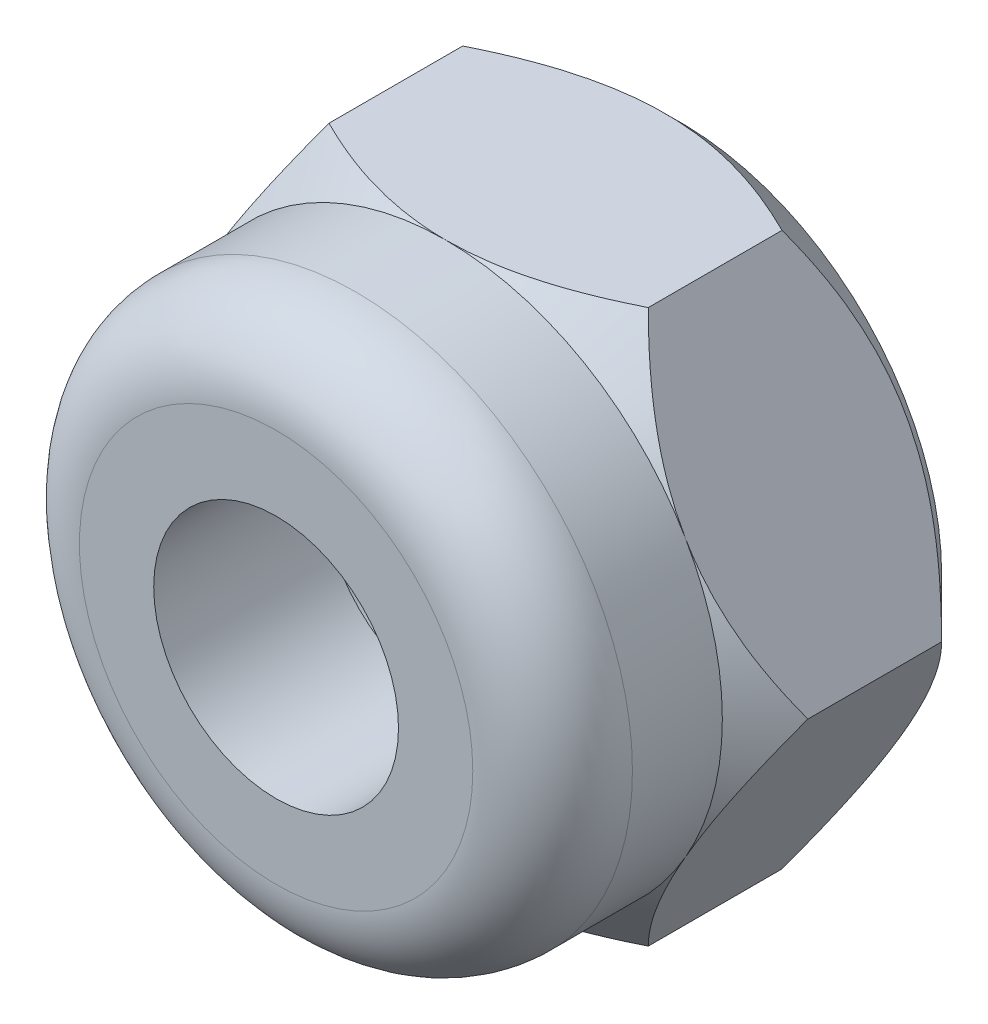
ISO-10303-21;
HEADER;
FILE_DESCRIPTION(('STEP AP214'),'2;1');
FILE_NAME('part.step','',(''),(''),'','','');
FILE_SCHEMA(('AUTOMOTIVE_DESIGN { 1 0 10303 214 1 1 1 1 }'));
ENDSEC;
DATA;
#1=APPLICATION_CONTEXT('core data for automotive mechanical design processes');
#2=APPLICATION_PROTOCOL_DEFINITION('international standard','automotive_design',2000,#1);
#3=PRODUCT_CONTEXT('',#1,'mechanical');
#4=PRODUCT('Part','Part','',(#3));
#5=PRODUCT_RELATED_PRODUCT_CATEGORY('part','',(#4));
#6=PRODUCT_DEFINITION_FORMATION('','',#4);
#7=PRODUCT_DEFINITION_CONTEXT('part definition',#1,'design');
#8=PRODUCT_DEFINITION('design','',#6,#7);
#9=PRODUCT_DEFINITION_SHAPE('','',#8);
#10=(LENGTH_UNIT() NAMED_UNIT(*) SI_UNIT(.MILLI.,.METRE.));
#11=(NAMED_UNIT(*) PLANE_ANGLE_UNIT() SI_UNIT($,.RADIAN.));
#12=(NAMED_UNIT(*) SI_UNIT($,.STERADIAN.) SOLID_ANGLE_UNIT());
#13=UNCERTAINTY_MEASURE_WITH_UNIT(LENGTH_MEASURE(1.E-05),#10,'distance_accuracy_value','');
#14=(GEOMETRIC_REPRESENTATION_CONTEXT(3) GLOBAL_UNCERTAINTY_ASSIGNED_CONTEXT((#13)) GLOBAL_UNIT_ASSIGNED_CONTEXT((#10,
#11,#12)) REPRESENTATION_CONTEXT('',''));
#15=CARTESIAN_POINT('',(0.,0.,0.));
#16=DIRECTION('',(0.,0.,1.));
#17=DIRECTION('',(1.,0.,0.));
#18=AXIS2_PLACEMENT_3D('',#15,#16,#17);
#19=CARTESIAN_POINT('',(0.,0.,2.57386505553611));
#20=DIRECTION('',(0.,0.,-1.));
#21=DIRECTION('',(-1.,0.,0.));
#22=AXIS2_PLACEMENT_3D('',#19,#20,#21);
#23=CONICAL_SURFACE('',#22,2.22942842933192,0.785398163397449);
#24=CARTESIAN_POINT('',(-1.49988452994616,2.59827621135331,1.80317800814779));
#25=CARTESIAN_POINT('',(-1.55144722349691,2.5089670063483,1.85469711775875));
#26=CARTESIAN_POINT('',(-1.60387211673928,2.41816442767115,1.90319046663452));
#27=CARTESIAN_POINT('',(-1.71077226218962,2.23300794441466,1.99198068849083));
#28=CARTESIAN_POINT('',(-1.76525768116978,2.13863643046934,2.03222815795243));
#29=CARTESIAN_POINT('',(-1.87512493116896,1.94834077138289,2.10117288839556));
#30=CARTESIAN_POINT('',(-1.93047878107054,1.85246509095881,2.13004344180867));
#31=CARTESIAN_POINT('',(-2.04240509746255,1.65860302426383,2.17452454451345));
#32=CARTESIAN_POINT('',(-2.09897414464143,1.56062256041425,2.19016829834001));
#33=CARTESIAN_POINT('',(-2.19646775987112,1.39175866542285,2.2042830000289));
#34=CARTESIAN_POINT('',(-2.23726637253299,1.32109339541416,2.20637244971718));
#35=CARTESIAN_POINT('',(-2.31879690787062,1.1798783658411,2.20285246120791));
#36=CARTESIAN_POINT('',(-2.35952880215513,1.10932865545181,2.19724032394711));
#37=CARTESIAN_POINT('',(-2.44060798692277,0.968895387997985,2.17863652716557));
#38=CARTESIAN_POINT('',(-2.48095479574427,0.899012665195873,2.16563661254145));
#39=CARTESIAN_POINT('',(-2.5609507195936,0.760455660690437,2.13297085921837));
#40=CARTESIAN_POINT('',(-2.60059988786284,0.691781286770257,2.11330553154122));
#41=CARTESIAN_POINT('',(-2.70215750741296,0.515878329813701,2.05492522459005));
#42=CARTESIAN_POINT('',(-2.76343628015066,0.409740382006532,2.01180983988893));
#43=CARTESIAN_POINT('',(-2.85354136829699,0.253673791316613,1.93902524931138));
#44=CARTESIAN_POINT('',(-2.88323502253943,0.20224287350633,1.91345210628246));
#45=CARTESIAN_POINT('',(-2.94207231156912,0.100333699527289,1.85997464795391));
#46=CARTESIAN_POINT('',(-2.97121627071292,0.049854881556518,1.83207176369631));
#47=CARTESIAN_POINT('',(-3.00011547005383,-0.000200000000003645,1.80317800814779));
#48=B_SPLINE_CURVE_WITH_KNOTS('',3,(#24,#25,#26,#27,#28,#29,#30,#31,#32,#33,#34,#35,#36,#37,#38,
#39,#40,#41,#42,#43,#44,#45,#46,#47),.UNSPECIFIED.,.F.,.F.,(4,2,2,2,2,2,2,2,2,2,2,4),(0.,
0.346074163660386,0.694164747986284,1.03672682350145,1.37842635662141,1.62295169669973,
1.86756275390828,2.11244767848963,2.3573138325552,2.74625844207636,2.94020339848826,
3.13403008860789),.UNSPECIFIED.);
#49=CARTESIAN_POINT('',(-1.5,2.59807621135331,1.80329348486803));
#50=VERTEX_POINT('',#49);
#51=CARTESIAN_POINT('',(-2.24999999999999,1.29903810567667,2.20521727351503));
#52=VERTEX_POINT('',#51);
#53=EDGE_CURVE('E196',#50,#52,#48,.T.);
#54=ORIENTED_EDGE('',*,*,#53,.T.);
#55=CARTESIAN_POINT('',(0.,0.,2.20521727351471));
#56=DIRECTION('',(0.,0.,-1.));
#57=DIRECTION('',(-1.,0.,0.));
#58=AXIS2_PLACEMENT_3D('',#55,#56,#57);
#59=CIRCLE('',#58,2.59807621135331);
#60=CARTESIAN_POINT('',(0.,2.59807621135331,2.20521727351503));
#61=VERTEX_POINT('',#60);
#62=EDGE_CURVE('E66',#52,#61,#59,.T.);
#63=ORIENTED_EDGE('',*,*,#62,.T.);
#64=CARTESIAN_POINT('',(-3.80350912944925,2.5980762113533,0.197136551175509));
#65=CARTESIAN_POINT('',(-3.70778366379153,2.5980762113533,0.276161413954016));
#66=CARTESIAN_POINT('',(-3.61160683557953,2.5980762113533,0.354648000713734));
#67=CARTESIAN_POINT('',(-3.41811677521426,2.59807621135331,0.510256407395326));
#68=CARTESIAN_POINT('',(-3.32080326399709,2.59807621135331,0.587377879963412));
#69=CARTESIAN_POINT('',(-3.12377066439065,2.59807621135331,0.740771263090381));
#70=CARTESIAN_POINT('',(-3.02403687478413,2.59807621135331,0.817024351054172));
#71=CARTESIAN_POINT('',(-2.82294264473002,2.59807621135331,0.967339820751415));
#72=CARTESIAN_POINT('',(-2.72158236587453,2.59807621135331,1.04140241805735));
#73=CARTESIAN_POINT('',(-2.50688663109646,2.59807621135331,1.19383211410952));
#74=CARTESIAN_POINT('',(-2.39334766095523,2.59807621135331,1.27191418152115));
#75=CARTESIAN_POINT('',(-2.16325208419809,2.59807621135331,1.42362357476867));
#76=CARTESIAN_POINT('',(-2.04669446810095,2.59807621135331,1.49724938216295));
#77=CARTESIAN_POINT('',(-1.8104523090726,2.59807621135331,1.63804860169915));
#78=CARTESIAN_POINT('',(-1.6907850029265,2.59807621135331,1.70525066658593));
#79=CARTESIAN_POINT('',(-1.44712532801577,2.59807621135331,1.83120605511657));
#80=CARTESIAN_POINT('',(-1.32313694802485,2.59807621135331,1.88996692688583));
#81=CARTESIAN_POINT('',(-1.10791398561966,2.59807621135331,1.9799990264565));
#82=CARTESIAN_POINT('',(-1.01793220088156,2.59807621135331,2.014243461323));
#83=CARTESIAN_POINT('',(-0.835493617661217,2.59807621135331,2.07553399190125));
#84=CARTESIAN_POINT('',(-0.743036484527015,2.59807621135331,2.10257910884552));
#85=CARTESIAN_POINT('',(-0.558099551090691,2.59807621135331,2.14742777571088));
#86=CARTESIAN_POINT('',(-0.465668229321034,2.59807621135331,2.16542778292097));
#87=CARTESIAN_POINT('',(-0.279437905275916,2.59807621135331,2.19185607646539));
#88=CARTESIAN_POINT('',(-0.185639254182876,2.59807621135331,2.2002867781737));
#89=CARTESIAN_POINT('',(-0.00286700016591524,2.59807621135331,2.20673212428979));
#90=CARTESIAN_POINT('',(0.0860872252265455,2.59807621135331,2.20529589531127));
#91=CARTESIAN_POINT('',(0.263383941558777,2.59807621135332,2.19339993733031));
#92=CARTESIAN_POINT('',(0.35172639123118,2.59807621135332,2.18293960546939));
#93=CARTESIAN_POINT('',(0.528709715545314,2.59807621135332,2.15343251877548));
#94=CARTESIAN_POINT('',(0.617322932984045,2.59807621135332,2.13422260731961));
#95=CARTESIAN_POINT('',(0.792550777862135,2.59807621135332,2.08833762809652));
#96=CARTESIAN_POINT('',(0.879165421988332,2.59807621135332,2.06166262268259));
#97=CARTESIAN_POINT('',(1.13858438588009,2.59807621135332,1.97138190073666));
#98=CARTESIAN_POINT('',(1.30802338603824,2.59807621135332,1.89808621458222));
#99=CARTESIAN_POINT('',(1.55603490347591,2.59807621135332,1.77574019593487));
#100=CARTESIAN_POINT('',(1.63782953061901,2.59807621135332,1.73279821319224));
#101=CARTESIAN_POINT('',(1.7995730895952,2.59807621135332,1.64356109017714));
#102=CARTESIAN_POINT('',(1.87952233518487,2.59807621135332,1.59726652554051));
#103=CARTESIAN_POINT('',(2.03387519181044,2.59807621135332,1.5043477169799));
#104=CARTESIAN_POINT('',(2.10835758287758,2.59807621135332,1.4578528790655));
#105=CARTESIAN_POINT('',(2.25604412200338,2.59807621135332,1.36286625810512));
#106=CARTESIAN_POINT('',(2.3292481750286,2.59807621135332,1.31437432748485));
#107=CARTESIAN_POINT('',(2.4739607958091,2.59807621135332,1.21613913205243));
#108=CARTESIAN_POINT('',(2.54547820472303,2.59807621135332,1.16640883742518));
#109=CARTESIAN_POINT('',(2.68752952525411,2.59807621135332,1.06560222019825));
#110=CARTESIAN_POINT('',(2.75806370232726,2.59807621135332,1.014526272103));
#111=CARTESIAN_POINT('',(2.82818506391956,2.59807621135332,0.962898875485065));
#112=B_SPLINE_CURVE_WITH_KNOTS('',3,(#64,#65,#66,#67,#68,#69,#70,#71,#72,#73,#74,#75,#76,#77,
#78,#79,#80,#81,#82,#83,#84,#85,#86,#87,#88,#89,#90,#91,#92,#93,#94,#95,#96,#97,#98,#99,#100,
#101,#102,#103,#104,#105,#106,#107,#108,#109,#110,#111),.UNSPECIFIED.,.F.,.F.,(4,2,2,2,2,2,2,2,
2,2,2,2,2,2,2,2,2,2,2,2,2,2,2,4),(0.,0.372396476963739,0.744886386345557,1.12149496460174,
1.49806635555984,1.9113780602901,2.32482981450828,2.73634172711931,3.14748334364566,
3.43607713103734,3.72471013354955,4.00676919802309,4.28875705255052,4.55518366841084,
4.82162808437625,5.09325835797445,5.36488636280862,5.91702911931544,6.19414916038392,
6.47122173244488,6.73459875975047,6.99799528422773,7.25930337482965,7.52053949423537),.UNSPECIFIED.);
#113=EDGE_CURVE('E204',#61,#50,#112,.F.);
#114=ORIENTED_EDGE('',*,*,#113,.T.);
#115=EDGE_LOOP('',(#54,#63,#114));
#116=FACE_BOUND('',#115,.T.);
#117=ADVANCED_FACE('F51',(#116),#23,.T.);
#118=CARTESIAN_POINT('',(1.5,2.59807621135332,1.80329348486803));
#119=VERTEX_POINT('',#118);
#120=EDGE_CURVE('E137',#119,#61,#112,.F.);
#121=ORIENTED_EDGE('',*,*,#120,.T.);
#122=CARTESIAN_POINT('',(2.25,1.29903810567666,2.20521727351503));
#123=VERTEX_POINT('',#122);
#124=EDGE_CURVE('E123',#61,#123,#59,.T.);
#125=ORIENTED_EDGE('',*,*,#124,.T.);
#126=CARTESIAN_POINT('',(3.00011547005384,-0.00019999999999772,1.80317800814778));
#127=CARTESIAN_POINT('',(2.94855277650309,0.0891092050050084,1.85469711775875));
#128=CARTESIAN_POINT('',(2.89612788326072,0.179911783682164,1.90319046663452));
#129=CARTESIAN_POINT('',(2.78922773781038,0.365068266938651,1.99198068849083));
#130=CARTESIAN_POINT('',(2.73474231883022,0.459439780883976,2.03222815795242));
#131=CARTESIAN_POINT('',(2.62487506883104,0.649735439970426,2.10117288839556));
#132=CARTESIAN_POINT('',(2.56952121892946,0.745611120394506,2.13004344180866));
#133=CARTESIAN_POINT('',(2.45759490253745,0.939473187089484,2.17452454451344));
#134=CARTESIAN_POINT('',(2.40102585535857,1.03745365093907,2.19016829834));
#135=CARTESIAN_POINT('',(2.30353224012888,1.20631754593047,2.20428300002889));
#136=CARTESIAN_POINT('',(2.262733627467,1.27698281593916,2.20637244971717));
#137=CARTESIAN_POINT('',(2.18120309212938,1.41819784551222,2.2028524612079));
#138=CARTESIAN_POINT('',(2.14047119784487,1.4887475559015,2.1972403239471));
#139=CARTESIAN_POINT('',(2.05939201307723,1.62918082335533,2.17863652716556));
#140=CARTESIAN_POINT('',(2.01904520425572,1.69906354615744,2.16563661254144));
#141=CARTESIAN_POINT('',(1.9390492804064,1.83762055066288,2.13297085921836));
#142=CARTESIAN_POINT('',(1.89940011213715,1.90629492458306,2.11330553154121));
#143=CARTESIAN_POINT('',(1.79784249258704,2.08219788153961,2.05492522459005));
#144=CARTESIAN_POINT('',(1.73656371984933,2.18833582934678,2.01180983988892));
#145=CARTESIAN_POINT('',(1.646458631703,2.3444024200367,1.93902524931138));
#146=CARTESIAN_POINT('',(1.61676497746056,2.39583333784698,1.91345210628246));
#147=CARTESIAN_POINT('',(1.55792768843087,2.49774251182602,1.85997464795391));
#148=CARTESIAN_POINT('',(1.52878372928707,2.54822132979679,1.83207176369631));
#149=CARTESIAN_POINT('',(1.49988452994616,2.59827621135331,1.80317800814778));
#150=B_SPLINE_CURVE_WITH_KNOTS('',3,(#126,#127,#128,#129,#130,#131,#132,#133,#134,#135,#136,
#137,#138,#139,#140,#141,#142,#143,#144,#145,#146,#147,#148,#149),.UNSPECIFIED.,.F.,.F.,(4,2,2,
2,2,2,2,2,2,2,2,4),(0.,0.346074163660387,0.694164747986286,1.03672682350145,1.37842635662141,
1.62295169669973,1.86756275390829,2.11244767848964,2.35731383255521,2.74625844207636,
2.94020339848826,3.13403008860789),.UNSPECIFIED.);
#151=EDGE_CURVE('E135',#123,#119,#150,.T.);
#152=ORIENTED_EDGE('',*,*,#151,.T.);
#153=EDGE_LOOP('',(#121,#125,#152));
#154=FACE_BOUND('',#153,.T.);
#155=ADVANCED_FACE('F134',(#154),#23,.T.);
#156=CARTESIAN_POINT('',(3.,0.,1.80329348486803));
#157=VERTEX_POINT('',#156);
#158=EDGE_CURVE('E144',#157,#123,#150,.T.);
#159=ORIENTED_EDGE('',*,*,#158,.T.);
#160=CARTESIAN_POINT('',(2.25,-1.29903810567665,2.20521727351503));
#161=VERTEX_POINT('',#160);
#162=EDGE_CURVE('E120',#123,#161,#59,.T.);
#163=ORIENTED_EDGE('',*,*,#162,.T.);
#164=CARTESIAN_POINT('',(1.49988452994617,-2.59827621135331,1.80317800814778));
#165=CARTESIAN_POINT('',(1.55144722349692,-2.50896700634831,1.85469711775875));
#166=CARTESIAN_POINT('',(1.60387211673929,-2.41816442767115,1.90319046663452));
#167=CARTESIAN_POINT('',(1.71077226218963,-2.23300794441466,1.99198068849083));
#168=CARTESIAN_POINT('',(1.76525768116979,-2.13863643046934,2.03222815795242));
#169=CARTESIAN_POINT('',(1.87512493116897,-1.94834077138289,2.10117288839556));
#170=CARTESIAN_POINT('',(1.93047878107055,-1.85246509095881,2.13004344180866));
#171=CARTESIAN_POINT('',(2.04240509746255,-1.65860302426383,2.17452454451344));
#172=CARTESIAN_POINT('',(2.09897414464143,-1.56062256041425,2.19016829834));
#173=CARTESIAN_POINT('',(2.19646775987113,-1.39175866542285,2.20428300002889));
#174=CARTESIAN_POINT('',(2.237266372533,-1.32109339541416,2.20637244971717));
#175=CARTESIAN_POINT('',(2.31879690787063,-1.1798783658411,2.2028524612079));
#176=CARTESIAN_POINT('',(2.35952880215513,-1.10932865545181,2.1972403239471));
#177=CARTESIAN_POINT('',(2.44060798692278,-0.968895387997986,2.17863652716556));
#178=CARTESIAN_POINT('',(2.48095479574428,-0.899012665195874,2.16563661254144));
#179=CARTESIAN_POINT('',(2.5609507195936,-0.760455660690437,2.13297085921836));
#180=CARTESIAN_POINT('',(2.60059988786285,-0.691781286770257,2.11330553154121));
#181=CARTESIAN_POINT('',(2.70215750741297,-0.515878329813701,2.05492522459005));
#182=CARTESIAN_POINT('',(2.76343628015067,-0.409740382006532,2.01180983988892));
#183=CARTESIAN_POINT('',(2.853541368297,-0.253673791316613,1.93902524931138));
#184=CARTESIAN_POINT('',(2.88323502253944,-0.20224287350633,1.91345210628245));
#185=CARTESIAN_POINT('',(2.94207231156913,-0.10033369952729,1.85997464795391));
#186=CARTESIAN_POINT('',(2.97121627071293,-0.0498548815565191,1.83207176369631));
#187=CARTESIAN_POINT('',(3.00011547005384,0.000200000000002303,1.80317800814778));
#188=B_SPLINE_CURVE_WITH_KNOTS('',3,(#164,#165,#166,#167,#168,#169,#170,#171,#172,#173,#174,
#175,#176,#177,#178,#179,#180,#181,#182,#183,#184,#185,#186,#187),.UNSPECIFIED.,.F.,.F.,(4,2,2,
2,2,2,2,2,2,2,2,4),(0.,0.346074163660386,0.694164747986284,1.03672682350145,1.37842635662141,
1.62295169669973,1.86756275390828,2.11244767848963,2.35731383255521,2.74625844207636,
2.94020339848826,3.13403008860789),.UNSPECIFIED.);
#189=EDGE_CURVE('E152',#161,#157,#188,.T.);
#190=ORIENTED_EDGE('',*,*,#189,.T.);
#191=EDGE_LOOP('',(#159,#163,#190));
#192=FACE_BOUND('',#191,.T.);
#193=ADVANCED_FACE('F151',(#192),#23,.T.);
#194=CARTESIAN_POINT('',(1.50000000000001,-2.59807621135331,1.80329348486803));
#195=VERTEX_POINT('',#194);
#196=EDGE_CURVE('E156',#195,#161,#188,.T.);
#197=ORIENTED_EDGE('',*,*,#196,.T.);
#198=CARTESIAN_POINT('',(0.,-2.59807621135331,2.20521727351503));
#199=VERTEX_POINT('',#198);
#200=EDGE_CURVE('E125',#161,#199,#59,.T.);
#201=ORIENTED_EDGE('',*,*,#200,.T.);
#202=CARTESIAN_POINT('',(-3.80350912944925,-2.59807621135332,0.197136551175498));
#203=CARTESIAN_POINT('',(-3.70778366379153,-2.59807621135332,0.276161413954005));
#204=CARTESIAN_POINT('',(-3.61160683557953,-2.59807621135332,0.354648000713724));
#205=CARTESIAN_POINT('',(-3.41811677521426,-2.59807621135332,0.510256407395316));
#206=CARTESIAN_POINT('',(-3.32080326399709,-2.59807621135332,0.587377879963403));
#207=CARTESIAN_POINT('',(-3.12377066439065,-2.59807621135332,0.740771263090372));
#208=CARTESIAN_POINT('',(-3.02403687478413,-2.59807621135332,0.817024351054164));
#209=CARTESIAN_POINT('',(-2.82294264473002,-2.59807621135332,0.967339820751409));
#210=CARTESIAN_POINT('',(-2.72158236587452,-2.59807621135332,1.04140241805734));
#211=CARTESIAN_POINT('',(-2.50688663109645,-2.59807621135332,1.19383211410951));
#212=CARTESIAN_POINT('',(-2.39334766095522,-2.59807621135332,1.27191418152114));
#213=CARTESIAN_POINT('',(-2.16325208419808,-2.59807621135332,1.42362357476867));
#214=CARTESIAN_POINT('',(-2.04669446810094,-2.59807621135332,1.49724938216295));
#215=CARTESIAN_POINT('',(-1.81045230907259,-2.59807621135332,1.63804860169915));
#216=CARTESIAN_POINT('',(-1.69078500292649,-2.59807621135332,1.70525066658593));
#217=CARTESIAN_POINT('',(-1.44712532801577,-2.59807621135332,1.83120605511657));
#218=CARTESIAN_POINT('',(-1.32313694802484,-2.59807621135332,1.88996692688582));
#219=CARTESIAN_POINT('',(-1.10791398561965,-2.59807621135332,1.9799990264565));
#220=CARTESIAN_POINT('',(-1.01793220088155,-2.59807621135332,2.014243461323));
#221=CARTESIAN_POINT('',(-0.835493617661208,-2.59807621135332,2.07553399190125));
#222=CARTESIAN_POINT('',(-0.743036484527007,-2.59807621135332,2.10257910884551));
#223=CARTESIAN_POINT('',(-0.558099551090683,-2.59807621135332,2.14742777571088));
#224=CARTESIAN_POINT('',(-0.465668229321026,-2.59807621135332,2.16542778292096));
#225=CARTESIAN_POINT('',(-0.279437905275908,-2.59807621135331,2.19185607646539));
#226=CARTESIAN_POINT('',(-0.185639254182867,-2.59807621135331,2.2002867781737));
#227=CARTESIAN_POINT('',(-0.00286700016590566,-2.59807621135331,2.20673212428979));
#228=CARTESIAN_POINT('',(0.086087225226555,-2.59807621135331,2.20529589531127));
#229=CARTESIAN_POINT('',(0.263383941558787,-2.59807621135331,2.19339993733031));
#230=CARTESIAN_POINT('',(0.351726391231191,-2.59807621135331,2.18293960546939));
#231=CARTESIAN_POINT('',(0.528709715545325,-2.59807621135331,2.15343251877548));
#232=CARTESIAN_POINT('',(0.617322932984055,-2.59807621135331,2.13422260731962));
#233=CARTESIAN_POINT('',(0.792550777862147,-2.59807621135331,2.08833762809652));
#234=CARTESIAN_POINT('',(0.879165421988343,-2.59807621135331,2.06166262268259));
#235=CARTESIAN_POINT('',(1.1385843858801,-2.59807621135331,1.97138190073666));
#236=CARTESIAN_POINT('',(1.30802338603825,-2.59807621135331,1.89808621458222));
#237=CARTESIAN_POINT('',(1.55603490347592,-2.59807621135331,1.77574019593487));
#238=CARTESIAN_POINT('',(1.63782953061902,-2.59807621135331,1.73279821319224));
#239=CARTESIAN_POINT('',(1.79957308959521,-2.59807621135331,1.64356109017714));
#240=CARTESIAN_POINT('',(1.87952233518488,-2.59807621135331,1.59726652554051));
#241=CARTESIAN_POINT('',(2.03387519181045,-2.59807621135331,1.5043477169799));
#242=CARTESIAN_POINT('',(2.10835758287759,-2.59807621135331,1.4578528790655));
#243=CARTESIAN_POINT('',(2.25604412200339,-2.59807621135331,1.36286625810511));
#244=CARTESIAN_POINT('',(2.32924817502861,-2.59807621135331,1.31437432748485));
#245=CARTESIAN_POINT('',(2.47396079580911,-2.59807621135331,1.21613913205243));
#246=CARTESIAN_POINT('',(2.54547820472304,-2.59807621135331,1.16640883742518));
#247=CARTESIAN_POINT('',(2.68752952525412,-2.59807621135331,1.06560222019825));
#248=CARTESIAN_POINT('',(2.75806370232728,-2.59807621135331,1.01452627210299));
#249=CARTESIAN_POINT('',(2.82818506391958,-2.59807621135331,0.962898875485063));
#250=B_SPLINE_CURVE_WITH_KNOTS('',3,(#202,#203,#204,#205,#206,#207,#208,#209,#210,#211,#212,
#213,#214,#215,#216,#217,#218,#219,#220,#221,#222,#223,#224,#225,#226,#227,#228,#229,#230,#231,
#232,#233,#234,#235,#236,#237,#238,#239,#240,#241,#242,#243,#244,#245,#246,#247,#248,#249),
.UNSPECIFIED.,.F.,.F.,(4,2,2,2,2,2,2,2,2,2,2,2,2,2,2,2,2,2,2,2,2,2,2,4),(0.,0.37239647696374,
0.74488638634556,1.12149496460175,1.49806635555984,1.91137806029011,2.32482981450829,
2.73634172711932,3.14748334364567,3.43607713103736,3.72471013354956,4.00676919802311,
4.28875705255053,4.55518366841086,4.82162808437627,5.09325835797447,5.36488636280864,
5.91702911931546,6.19414916038394,6.47122173244491,6.73459875975049,6.99799528422776,
7.25930337482967,7.52053949423539),.UNSPECIFIED.);
#251=EDGE_CURVE('E287',#199,#195,#250,.T.);
#252=ORIENTED_EDGE('',*,*,#251,.T.);
#253=EDGE_LOOP('',(#197,#201,#252));
#254=FACE_BOUND('',#253,.T.);
#255=ADVANCED_FACE('F381',(#254),#23,.T.);
#256=CARTESIAN_POINT('',(-1.49999999999999,-2.59807621135331,1.80329348486803));
#257=VERTEX_POINT('',#256);
#258=EDGE_CURVE('E281',#257,#199,#250,.T.);
#259=ORIENTED_EDGE('',*,*,#258,.T.);
#260=CARTESIAN_POINT('',(-2.25,-1.29903810567666,2.20521727351503));
#261=VERTEX_POINT('',#260);
#262=EDGE_CURVE('E349',#199,#261,#59,.T.);
#263=ORIENTED_EDGE('',*,*,#262,.T.);
#264=CARTESIAN_POINT('',(-3.00011547005383,0.000199999999996393,1.80317800814779));
#265=CARTESIAN_POINT('',(-2.94855277650308,-0.0891092050050094,1.85469711775875));
#266=CARTESIAN_POINT('',(-2.89612788326071,-0.179911783682165,1.90319046663452));
#267=CARTESIAN_POINT('',(-2.78922773781038,-0.365068266938651,1.99198068849083));
#268=CARTESIAN_POINT('',(-2.73474231883021,-0.459439780883975,2.03222815795243));
#269=CARTESIAN_POINT('',(-2.62487506883103,-0.649735439970425,2.10117288839556));
#270=CARTESIAN_POINT('',(-2.56952121892945,-0.745611120394505,2.13004344180867));
#271=CARTESIAN_POINT('',(-2.45759490253745,-0.939473187089482,2.17452454451345));
#272=CARTESIAN_POINT('',(-2.40102585535857,-1.03745365093906,2.19016829834001));
#273=CARTESIAN_POINT('',(-2.30353224012887,-1.20631754593046,2.2042830000289));
#274=CARTESIAN_POINT('',(-2.262733627467,-1.27698281593915,2.20637244971718));
#275=CARTESIAN_POINT('',(-2.18120309212937,-1.41819784551221,2.20285246120791));
#276=CARTESIAN_POINT('',(-2.14047119784487,-1.4887475559015,2.19724032394711));
#277=CARTESIAN_POINT('',(-2.05939201307722,-1.62918082335533,2.17863652716557));
#278=CARTESIAN_POINT('',(-2.01904520425572,-1.69906354615744,2.16563661254144));
#279=CARTESIAN_POINT('',(-1.9390492804064,-1.83762055066287,2.13297085921837));
#280=CARTESIAN_POINT('',(-1.89940011213715,-1.90629492458305,2.11330553154122));
#281=CARTESIAN_POINT('',(-1.79784249258703,-2.08219788153961,2.05492522459005));
#282=CARTESIAN_POINT('',(-1.73656371984933,-2.18833582934678,2.01180983988893));
#283=CARTESIAN_POINT('',(-1.646458631703,-2.3444024200367,1.93902524931138));
#284=CARTESIAN_POINT('',(-1.61676497746056,-2.39583333784698,1.91345210628246));
#285=CARTESIAN_POINT('',(-1.55792768843087,-2.49774251182602,1.85997464795391));
#286=CARTESIAN_POINT('',(-1.52878372928707,-2.54822132979679,1.83207176369631));
#287=CARTESIAN_POINT('',(-1.49988452994616,-2.59827621135331,1.80317800814779));
#288=B_SPLINE_CURVE_WITH_KNOTS('',3,(#264,#265,#266,#267,#268,#269,#270,#271,#272,#273,#274,
#275,#276,#277,#278,#279,#280,#281,#282,#283,#284,#285,#286,#287),.UNSPECIFIED.,.F.,.F.,(4,2,2,
2,2,2,2,2,2,2,2,4),(0.,0.346074163660385,0.694164747986283,1.03672682350145,1.37842635662141,
1.62295169669972,1.86756275390828,2.11244767848963,2.3573138325552,2.74625844207636,
2.94020339848826,3.13403008860789),.UNSPECIFIED.);
#289=EDGE_CURVE('E244',#261,#257,#288,.T.);
#290=ORIENTED_EDGE('',*,*,#289,.T.);
#291=EDGE_LOOP('',(#259,#263,#290));
#292=FACE_BOUND('',#291,.T.);
#293=ADVANCED_FACE('F379',(#292),#23,.T.);
#294=CARTESIAN_POINT('',(-2.99999999999999,0.,1.80329348486804));
#295=VERTEX_POINT('',#294);
#296=EDGE_CURVE('E188',#295,#261,#288,.T.);
#297=ORIENTED_EDGE('',*,*,#296,.T.);
#298=EDGE_CURVE('E266',#261,#52,#59,.T.);
#299=ORIENTED_EDGE('',*,*,#298,.T.);
#300=EDGE_CURVE('E205',#52,#295,#48,.T.);
#301=ORIENTED_EDGE('',*,*,#300,.T.);
#302=EDGE_LOOP('',(#297,#299,#301));
#303=FACE_BOUND('',#302,.T.);
#304=ADVANCED_FACE('F180',(#303),#23,.T.);
#305=CARTESIAN_POINT('',(-1.49999999999999,-2.59807621135331,0.));
#306=DIRECTION('',(0.,0.,1.));
#307=DIRECTION('',(1.,0.,0.));
#308=AXIS2_PLACEMENT_3D('',#305,#306,#307);
#309=PLANE('',#308);
#310=CARTESIAN_POINT('',(0.,0.,0.));
#311=DIRECTION('',(0.,0.,-1.));
#312=DIRECTION('',(1.,0.,0.));
#313=AXIS2_PLACEMENT_3D('',#310,#311,#312);
#314=CIRCLE('',#313,1.2295);
#315=CARTESIAN_POINT('',(1.2295,0.,0.));
#316=VERTEX_POINT('',#315);
#317=EDGE_CURVE('E346',#316,#316,#314,.T.);
#318=ORIENTED_EDGE('',*,*,#317,.F.);
#319=EDGE_LOOP('',(#318));
#320=FACE_BOUND('',#319,.T.);
#321=CARTESIAN_POINT('',(0.,0.,0.));
#322=DIRECTION('',(0.,0.,1.));
#323=DIRECTION('',(1.,0.,0.));
#324=AXIS2_PLACEMENT_3D('',#321,#322,#323);
#325=CIRCLE('',#324,2.45329348486803);
#326=CARTESIAN_POINT('',(2.45329348486803,0.,0.));
#327=VERTEX_POINT('',#326);
#328=EDGE_CURVE('E305',#327,#327,#325,.T.);
#329=ORIENTED_EDGE('',*,*,#328,.F.);
#330=EDGE_LOOP('',(#329));
#331=FACE_BOUND('',#330,.T.);
#332=ADVANCED_FACE('F386',(#320,#331),#309,.F.);
#333=CARTESIAN_POINT('',(0.,0.,1.175));
#334=DIRECTION('',(0.,0.,1.));
#335=DIRECTION('',(1.,0.,0.));
#336=AXIS2_PLACEMENT_3D('',#333,#334,#335);
#337=CONICAL_SURFACE('',#336,3.62829348486803,0.785398163397447);
#338=ORIENTED_EDGE('',*,*,#328,.T.);
#339=EDGE_LOOP('',(#338));
#340=FACE_BOUND('',#339,.T.);
#341=CARTESIAN_POINT('',(3.00011547005384,0.000200000000002248,0.546821991852221));
#342=CARTESIAN_POINT('',(2.94855277650309,-0.0891092050050035,0.495302882241254));
#343=CARTESIAN_POINT('',(2.89612788326072,-0.179911783682159,0.446809533365483));
#344=CARTESIAN_POINT('',(2.78922773781038,-0.365068266938645,0.358019311509173));
#345=CARTESIAN_POINT('',(2.73474231883022,-0.459439780883969,0.317771842047577));
#346=CARTESIAN_POINT('',(2.62487506883104,-0.649735439970419,0.248827111604444));
#347=CARTESIAN_POINT('',(2.56952121892946,-0.745611120394499,0.219956558191336));
#348=CARTESIAN_POINT('',(2.45759490253746,-0.939473187089476,0.175475455486558));
#349=CARTESIAN_POINT('',(2.40102585535858,-1.03745365093906,0.159831701659996));
#350=CARTESIAN_POINT('',(2.30353224012888,-1.20631754593046,0.145716999971108));
#351=CARTESIAN_POINT('',(2.26273362746701,-1.27698281593915,0.14362755028283));
#352=CARTESIAN_POINT('',(2.18120309212938,-1.4181978455122,0.147147538792101));
#353=CARTESIAN_POINT('',(2.14047119784488,-1.48874755590149,0.152759676052897));
#354=CARTESIAN_POINT('',(2.05939201307723,-1.62918082335532,0.171363472834438));
#355=CARTESIAN_POINT('',(2.01904520425573,-1.69906354615743,0.18436338745856));
#356=CARTESIAN_POINT('',(1.93904928040641,-1.83762055066287,0.217029140781639));
#357=CARTESIAN_POINT('',(1.89940011213716,-1.90629492458305,0.236694468458787));
#358=CARTESIAN_POINT('',(1.79784249258705,-2.0821978815396,0.295074775409952));
#359=CARTESIAN_POINT('',(1.73656371984934,-2.18833582934677,0.338190160111078));
#360=CARTESIAN_POINT('',(1.64645863170301,-2.34440242003669,0.410974750688623));
#361=CARTESIAN_POINT('',(1.61676497746057,-2.39583333784698,0.436547893717545));
#362=CARTESIAN_POINT('',(1.55792768843088,-2.49774251182602,0.490025352046095));
#363=CARTESIAN_POINT('',(1.52878372928708,-2.54822132979679,0.517928236303693));
#364=CARTESIAN_POINT('',(1.49988452994617,-2.59827621135331,0.546821991852221));
#365=B_SPLINE_CURVE_WITH_KNOTS('',3,(#341,#342,#343,#344,#345,#346,#347,#348,#349,#350,#351,
#352,#353,#354,#355,#356,#357,#358,#359,#360,#361,#362,#363,#364),.UNSPECIFIED.,.F.,.F.,(4,2,2,
2,2,2,2,2,2,2,2,4),(0.,0.346074163660385,0.694164747986282,1.03672682350145,1.37842635662141,
1.62295169669972,1.86756275390828,2.11244767848963,2.3573138325552,2.74625844207635,
2.94020339848825,3.13403008860789),.UNSPECIFIED.);
#366=CARTESIAN_POINT('',(3.,0.,0.546706515131974));
#367=VERTEX_POINT('',#366);
#368=CARTESIAN_POINT('',(1.5,-2.59807621135331,0.546706515131971));
#369=VERTEX_POINT('',#368);
#370=EDGE_CURVE('E74',#367,#369,#365,.T.);
#371=ORIENTED_EDGE('',*,*,#370,.T.);
#372=CARTESIAN_POINT('',(-3.80350912944924,-2.59807621135332,2.1528634488245));
#373=CARTESIAN_POINT('',(-3.70778366379152,-2.59807621135332,2.073838586046));
#374=CARTESIAN_POINT('',(-3.61160683557952,-2.59807621135332,1.99535199928628));
#375=CARTESIAN_POINT('',(-3.41811677521425,-2.59807621135332,1.83974359260469));
#376=CARTESIAN_POINT('',(-3.32080326399708,-2.59807621135332,1.7626221200366));
#377=CARTESIAN_POINT('',(-3.12377066439065,-2.59807621135332,1.60922873690963));
#378=CARTESIAN_POINT('',(-3.02403687478413,-2.59807621135332,1.53297564894584));
#379=CARTESIAN_POINT('',(-2.82294264473001,-2.59807621135332,1.38266017924859));
#380=CARTESIAN_POINT('',(-2.72158236587452,-2.59807621135332,1.30859758194266));
#381=CARTESIAN_POINT('',(-2.50688663109645,-2.59807621135332,1.15616788589049));
#382=CARTESIAN_POINT('',(-2.39334766095522,-2.59807621135332,1.07808581847886));
#383=CARTESIAN_POINT('',(-2.16325208419808,-2.59807621135332,0.926376425231334));
#384=CARTESIAN_POINT('',(-2.04669446810094,-2.59807621135332,0.852750617837054));
#385=CARTESIAN_POINT('',(-1.81045230907259,-2.59807621135332,0.711951398300852));
#386=CARTESIAN_POINT('',(-1.69078500292649,-2.59807621135332,0.644749333414072));
#387=CARTESIAN_POINT('',(-1.44712532801577,-2.59807621135332,0.51879394488343));
#388=CARTESIAN_POINT('',(-1.32313694802484,-2.59807621135332,0.460033073114177));
#389=CARTESIAN_POINT('',(-1.10791398561965,-2.59807621135332,0.3700009735435));
#390=CARTESIAN_POINT('',(-1.01793220088155,-2.59807621135332,0.335756538677002));
#391=CARTESIAN_POINT('',(-0.835493617661211,-2.59807621135332,0.274466008098753));
#392=CARTESIAN_POINT('',(-0.743036484527009,-2.59807621135332,0.247420891154486));
#393=CARTESIAN_POINT('',(-0.558099551090686,-2.59807621135332,0.202572224289124));
#394=CARTESIAN_POINT('',(-0.465668229321029,-2.59807621135332,0.184572217079036));
#395=CARTESIAN_POINT('',(-0.279437905275911,-2.59807621135331,0.15814392353461));
#396=CARTESIAN_POINT('',(-0.185639254182871,-2.59807621135331,0.149713221826298));
#397=CARTESIAN_POINT('',(-0.00286700016591032,-2.59807621135331,0.143267875710212));
#398=CARTESIAN_POINT('',(0.0860872252265501,-2.59807621135331,0.144704104688729));
#399=CARTESIAN_POINT('',(0.263383941558781,-2.59807621135331,0.156600062669694));
#400=CARTESIAN_POINT('',(0.351726391231185,-2.59807621135331,0.167060394530606));
#401=CARTESIAN_POINT('',(0.528709715545319,-2.59807621135331,0.196567481224519));
#402=CARTESIAN_POINT('',(0.617322932984049,-2.59807621135331,0.215777392680383));
#403=CARTESIAN_POINT('',(0.79255077786214,-2.59807621135331,0.261662371903476));
#404=CARTESIAN_POINT('',(0.879165421988336,-2.59807621135331,0.288337377317411));
#405=CARTESIAN_POINT('',(1.13858438588009,-2.59807621135331,0.378618099263342));
#406=CARTESIAN_POINT('',(1.30802338603824,-2.59807621135331,0.451913785417774));
#407=CARTESIAN_POINT('',(1.55603490347591,-2.59807621135331,0.574259804065128));
#408=CARTESIAN_POINT('',(1.63782953061901,-2.59807621135331,0.617201786807756));
#409=CARTESIAN_POINT('',(1.79957308959519,-2.59807621135331,0.706438909822855));
#410=CARTESIAN_POINT('',(1.87952233518486,-2.59807621135331,0.752733474459483));
#411=CARTESIAN_POINT('',(2.03387519181043,-2.59807621135331,0.845652283020088));
#412=CARTESIAN_POINT('',(2.10835758287757,-2.59807621135331,0.892147120934487));
#413=CARTESIAN_POINT('',(2.25604412200337,-2.59807621135331,0.987133741894875));
#414=CARTESIAN_POINT('',(2.32924817502859,-2.59807621135331,1.03562567251514));
#415=CARTESIAN_POINT('',(2.47396079580908,-2.59807621135331,1.13386086794756));
#416=CARTESIAN_POINT('',(2.54547820472302,-2.59807621135331,1.18359116257481));
#417=CARTESIAN_POINT('',(2.68752952525409,-2.59807621135331,1.28439777980173));
#418=CARTESIAN_POINT('',(2.75806370232725,-2.59807621135331,1.33547372789699));
#419=CARTESIAN_POINT('',(2.82818506391955,-2.59807621135331,1.38710112451492));
#420=B_SPLINE_CURVE_WITH_KNOTS('',3,(#372,#373,#374,#375,#376,#377,#378,#379,#380,#381,#382,
#383,#384,#385,#386,#387,#388,#389,#390,#391,#392,#393,#394,#395,#396,#397,#398,#399,#400,#401,
#402,#403,#404,#405,#406,#407,#408,#409,#410,#411,#412,#413,#414,#415,#416,#417,#418,#419),
.UNSPECIFIED.,.F.,.F.,(4,2,2,2,2,2,2,2,2,2,2,2,2,2,2,2,2,2,2,2,2,2,2,4),(0.,0.372396476963739,
0.744886386345558,1.12149496460175,1.49806635555984,1.9113780602901,2.32482981450828,
2.73634172711931,3.14748334364566,3.43607713103734,3.72471013354955,4.0067691980231,
4.28875705255052,4.55518366841084,4.82162808437625,5.09325835797446,5.36488636280863,
5.91702911931544,6.19414916038391,6.47122173244487,6.73459875975045,6.99799528422772,
7.25930337482963,7.52053949423535),.UNSPECIFIED.);
#421=CARTESIAN_POINT('',(-1.5,-2.59807621135332,0.546706515131969));
#422=VERTEX_POINT('',#421);
#423=EDGE_CURVE('E229',#369,#422,#420,.F.);
#424=ORIENTED_EDGE('',*,*,#423,.T.);
#425=CARTESIAN_POINT('',(-1.49988452994616,-2.59827621135331,0.546821991852216));
#426=CARTESIAN_POINT('',(-1.55144722349691,-2.50896700634831,0.49530288224125));
#427=CARTESIAN_POINT('',(-1.60387211673928,-2.41816442767115,0.446809533365478));
#428=CARTESIAN_POINT('',(-1.71077226218961,-2.23300794441467,0.358019311509169));
#429=CARTESIAN_POINT('',(-1.76525768116978,-2.13863643046934,0.317771842047573));
#430=CARTESIAN_POINT('',(-1.87512493116896,-1.94834077138289,0.248827111604439));
#431=CARTESIAN_POINT('',(-1.93047878107054,-1.85246509095881,0.219956558191331));
#432=CARTESIAN_POINT('',(-2.04240509746254,-1.65860302426384,0.175475455486553));
#433=CARTESIAN_POINT('',(-2.09897414464142,-1.56062256041426,0.15983170165999));
#434=CARTESIAN_POINT('',(-2.19646775987111,-1.39175866542286,0.145716999971102));
#435=CARTESIAN_POINT('',(-2.23726637253299,-1.32109339541417,0.143627550282825));
#436=CARTESIAN_POINT('',(-2.31879690787061,-1.17987836584111,0.147147538792095));
#437=CARTESIAN_POINT('',(-2.35952880215512,-1.10932865545182,0.15275967605289));
#438=CARTESIAN_POINT('',(-2.44060798692277,-0.968895387997996,0.171363472834432));
#439=CARTESIAN_POINT('',(-2.48095479574427,-0.899012665195885,0.184363387458554));
#440=CARTESIAN_POINT('',(-2.56095071959359,-0.76045566069045,0.217029140781632));
#441=CARTESIAN_POINT('',(-2.60059988786283,-0.69178128677027,0.23669446845878));
#442=CARTESIAN_POINT('',(-2.70215750741295,-0.515878329813714,0.295074775409945));
#443=CARTESIAN_POINT('',(-2.76343628015066,-0.409740382006544,0.338190160111071));
#444=CARTESIAN_POINT('',(-2.85354136829699,-0.253673791316623,0.410974750688615));
#445=CARTESIAN_POINT('',(-2.88323502253943,-0.202242873506339,0.436547893717538));
#446=CARTESIAN_POINT('',(-2.94207231156912,-0.100333699527297,0.490025352046089));
#447=CARTESIAN_POINT('',(-2.97121627071292,-0.0498548815565259,0.517928236303686));
#448=CARTESIAN_POINT('',(-3.00011547005383,0.000199999999996396,0.546821991852214));
#449=B_SPLINE_CURVE_WITH_KNOTS('',3,(#425,#426,#427,#428,#429,#430,#431,#432,#433,#434,#435,
#436,#437,#438,#439,#440,#441,#442,#443,#444,#445,#446,#447,#448),.UNSPECIFIED.,.F.,.F.,(4,2,2,
2,2,2,2,2,2,2,2,4),(0.,0.346074163660385,0.694164747986283,1.03672682350145,1.37842635662141,
1.62295169669972,1.86756275390828,2.11244767848962,2.3573138325552,2.74625844207635,
2.94020339848825,3.13403008860789),.UNSPECIFIED.);
#450=CARTESIAN_POINT('',(-2.99999999999999,0.,0.546706515131966));
#451=VERTEX_POINT('',#450);
#452=EDGE_CURVE('E220',#422,#451,#449,.T.);
#453=ORIENTED_EDGE('',*,*,#452,.T.);
#454=CARTESIAN_POINT('',(-3.00011547005383,-0.000200000000003677,0.546821991852214));
#455=CARTESIAN_POINT('',(-2.94855277650308,0.0891092050050022,0.495302882241248));
#456=CARTESIAN_POINT('',(-2.89612788326071,0.179911783682157,0.446809533365476));
#457=CARTESIAN_POINT('',(-2.78922773781038,0.365068266938643,0.358019311509167));
#458=CARTESIAN_POINT('',(-2.73474231883021,0.459439780883967,0.317771842047571));
#459=CARTESIAN_POINT('',(-2.62487506883103,0.649735439970417,0.248827111604438));
#460=CARTESIAN_POINT('',(-2.56952121892945,0.745611120394496,0.21995655819133));
#461=CARTESIAN_POINT('',(-2.45759490253745,0.939473187089473,0.175475455486552));
#462=CARTESIAN_POINT('',(-2.40102585535857,1.03745365093905,0.15983170165999));
#463=CARTESIAN_POINT('',(-2.30353224012888,1.20631754593045,0.145716999971101));
#464=CARTESIAN_POINT('',(-2.262733627467,1.27698281593914,0.143627550282824));
#465=CARTESIAN_POINT('',(-2.18120309212938,1.4181978455122,0.147147538792095));
#466=CARTESIAN_POINT('',(-2.14047119784487,1.48874755590149,0.15275967605289));
#467=CARTESIAN_POINT('',(-2.05939201307723,1.62918082335531,0.171363472834431));
#468=CARTESIAN_POINT('',(-2.01904520425573,1.69906354615743,0.184363387458554));
#469=CARTESIAN_POINT('',(-1.93904928040641,1.83762055066286,0.217029140781632));
#470=CARTESIAN_POINT('',(-1.89940011213716,1.90629492458304,0.23669446845878));
#471=CARTESIAN_POINT('',(-1.79784249258704,2.0821978815396,0.295074775409945));
#472=CARTESIAN_POINT('',(-1.73656371984934,2.18833582934677,0.338190160111072));
#473=CARTESIAN_POINT('',(-1.646458631703,2.34440242003669,0.410974750688617));
#474=CARTESIAN_POINT('',(-1.61676497746057,2.39583333784697,0.43654789371754));
#475=CARTESIAN_POINT('',(-1.55792768843088,2.49774251182602,0.490025352046091));
#476=CARTESIAN_POINT('',(-1.52878372928708,2.54822132979679,0.517928236303689));
#477=CARTESIAN_POINT('',(-1.49988452994616,2.59827621135331,0.546821991852217));
#478=B_SPLINE_CURVE_WITH_KNOTS('',3,(#454,#455,#456,#457,#458,#459,#460,#461,#462,#463,#464,
#465,#466,#467,#468,#469,#470,#471,#472,#473,#474,#475,#476,#477),.UNSPECIFIED.,.F.,.F.,(4,2,2,
2,2,2,2,2,2,2,2,4),(0.,0.346074163660384,0.694164747986281,1.03672682350144,1.3784263566214,
1.62295169669972,1.86756275390827,2.11244767848962,2.35731383255519,2.74625844207635,
2.94020339848826,3.13403008860789),.UNSPECIFIED.);
#479=CARTESIAN_POINT('',(-1.5,2.59807621135331,0.546706515131968));
#480=VERTEX_POINT('',#479);
#481=EDGE_CURVE('E212',#451,#480,#478,.T.);
#482=ORIENTED_EDGE('',*,*,#481,.T.);
#483=CARTESIAN_POINT('',(-3.80350912944924,2.5980762113533,2.15286344882449));
#484=CARTESIAN_POINT('',(-3.70778366379152,2.5980762113533,2.07383858604599));
#485=CARTESIAN_POINT('',(-3.61160683557952,2.5980762113533,1.99535199928627));
#486=CARTESIAN_POINT('',(-3.41811677521425,2.59807621135331,1.83974359260468));
#487=CARTESIAN_POINT('',(-3.32080326399708,2.59807621135331,1.76262212003659));
#488=CARTESIAN_POINT('',(-3.12377066439065,2.59807621135331,1.60922873690962));
#489=CARTESIAN_POINT('',(-3.02403687478413,2.59807621135331,1.53297564894583));
#490=CARTESIAN_POINT('',(-2.82294264473002,2.59807621135331,1.38266017924859));
#491=CARTESIAN_POINT('',(-2.72158236587452,2.59807621135331,1.30859758194265));
#492=CARTESIAN_POINT('',(-2.50688663109645,2.59807621135331,1.15616788589048));
#493=CARTESIAN_POINT('',(-2.39334766095522,2.59807621135331,1.07808581847885));
#494=CARTESIAN_POINT('',(-2.16325208419808,2.59807621135331,0.926376425231329));
#495=CARTESIAN_POINT('',(-2.04669446810095,2.59807621135331,0.852750617837049));
#496=CARTESIAN_POINT('',(-1.8104523090726,2.59807621135331,0.711951398300848));
#497=CARTESIAN_POINT('',(-1.6907850029265,2.59807621135331,0.644749333414069));
#498=CARTESIAN_POINT('',(-1.44712532801577,2.59807621135331,0.518793944883427));
#499=CARTESIAN_POINT('',(-1.32313694802485,2.59807621135331,0.460033073114175));
#500=CARTESIAN_POINT('',(-1.10791398561966,2.59807621135331,0.370000973543498));
#501=CARTESIAN_POINT('',(-1.01793220088156,2.59807621135331,0.335756538677));
#502=CARTESIAN_POINT('',(-0.835493617661218,2.59807621135331,0.274466008098751));
#503=CARTESIAN_POINT('',(-0.743036484527017,2.59807621135331,0.247420891154485));
#504=CARTESIAN_POINT('',(-0.558099551090694,2.59807621135331,0.202572224289124));
#505=CARTESIAN_POINT('',(-0.465668229321038,2.59807621135331,0.184572217079036));
#506=CARTESIAN_POINT('',(-0.279437905275921,2.59807621135331,0.15814392353461));
#507=CARTESIAN_POINT('',(-0.185639254182881,2.59807621135331,0.149713221826298));
#508=CARTESIAN_POINT('',(-0.00286700016592043,2.59807621135331,0.143267875710212));
#509=CARTESIAN_POINT('',(0.0860872252265397,2.59807621135331,0.144704104688729));
#510=CARTESIAN_POINT('',(0.26338394155877,2.59807621135332,0.156600062669694));
#511=CARTESIAN_POINT('',(0.351726391231174,2.59807621135332,0.167060394530605));
#512=CARTESIAN_POINT('',(0.528709715545308,2.59807621135332,0.196567481224519));
#513=CARTESIAN_POINT('',(0.617322932984038,2.59807621135332,0.215777392680383));
#514=CARTESIAN_POINT('',(0.792550777862128,2.59807621135332,0.261662371903477));
#515=CARTESIAN_POINT('',(0.879165421988324,2.59807621135332,0.288337377317412));
#516=CARTESIAN_POINT('',(1.13858438588008,2.59807621135332,0.378618099263342));
#517=CARTESIAN_POINT('',(1.30802338603823,2.59807621135332,0.451913785417774));
#518=CARTESIAN_POINT('',(1.5560349034759,2.59807621135332,0.574259804065128));
#519=CARTESIAN_POINT('',(1.637829530619,2.59807621135332,0.617201786807757));
#520=CARTESIAN_POINT('',(1.79957308959518,2.59807621135332,0.706438909822856));
#521=CARTESIAN_POINT('',(1.87952233518485,2.59807621135332,0.752733474459484));
#522=CARTESIAN_POINT('',(2.03387519181042,2.59807621135332,0.845652283020089));
#523=CARTESIAN_POINT('',(2.10835758287756,2.59807621135332,0.892147120934488));
#524=CARTESIAN_POINT('',(2.25604412200336,2.59807621135332,0.987133741894875));
#525=CARTESIAN_POINT('',(2.32924817502857,2.59807621135332,1.03562567251514));
#526=CARTESIAN_POINT('',(2.47396079580907,2.59807621135332,1.13386086794756));
#527=CARTESIAN_POINT('',(2.54547820472301,2.59807621135332,1.18359116257481));
#528=CARTESIAN_POINT('',(2.68752952525408,2.59807621135332,1.28439777980173));
#529=CARTESIAN_POINT('',(2.75806370232724,2.59807621135332,1.33547372789699));
#530=CARTESIAN_POINT('',(2.82818506391954,2.59807621135332,1.38710112451492));
#531=B_SPLINE_CURVE_WITH_KNOTS('',3,(#483,#484,#485,#486,#487,#488,#489,#490,#491,#492,#493,
#494,#495,#496,#497,#498,#499,#500,#501,#502,#503,#504,#505,#506,#507,#508,#509,#510,#511,#512,
#513,#514,#515,#516,#517,#518,#519,#520,#521,#522,#523,#524,#525,#526,#527,#528,#529,#530),
.UNSPECIFIED.,.F.,.F.,(4,2,2,2,2,2,2,2,2,2,2,2,2,2,2,2,2,2,2,2,2,2,2,4),(0.,0.372396476963738,
0.744886386345556,1.12149496460174,1.49806635555983,1.91137806029009,2.32482981450827,
2.7363417271193,3.14748334364565,3.43607713103733,3.72471013354954,4.00676919802308,
4.28875705255051,4.55518366841083,4.82162808437624,5.09325835797444,5.36488636280861,
5.91702911931542,6.1941491603839,6.47122173244486,6.73459875975044,6.9979952842277,
7.25930337482962,7.52053949423533),.UNSPECIFIED.);
#532=CARTESIAN_POINT('',(1.5,2.59807621135332,0.546706515131974));
#533=VERTEX_POINT('',#532);
#534=EDGE_CURVE('E219',#480,#533,#531,.T.);
#535=ORIENTED_EDGE('',*,*,#534,.T.);
#536=CARTESIAN_POINT('',(1.49988452994616,2.59827621135331,0.546821991852219));
#537=CARTESIAN_POINT('',(1.55144722349691,2.50896700634831,0.495302882241253));
#538=CARTESIAN_POINT('',(1.60387211673928,2.41816442767115,0.446809533365481));
#539=CARTESIAN_POINT('',(1.71077226218962,2.23300794441467,0.358019311509172));
#540=CARTESIAN_POINT('',(1.76525768116978,2.13863643046934,0.317771842047576));
#541=CARTESIAN_POINT('',(1.87512493116896,1.9483407713829,0.248827111604444));
#542=CARTESIAN_POINT('',(1.93047878107054,1.85246509095882,0.219956558191336));
#543=CARTESIAN_POINT('',(2.04240509746255,1.65860302426384,0.175475455486558));
#544=CARTESIAN_POINT('',(2.09897414464143,1.56062256041426,0.159831701659996));
#545=CARTESIAN_POINT('',(2.19646775987112,1.39175866542286,0.145716999971107));
#546=CARTESIAN_POINT('',(2.23726637253299,1.32109339541417,0.14362755028283));
#547=CARTESIAN_POINT('',(2.31879690787062,1.17987836584111,0.1471475387921));
#548=CARTESIAN_POINT('',(2.35952880215513,1.10932865545182,0.152759676052896));
#549=CARTESIAN_POINT('',(2.44060798692277,0.968895387998,0.171363472834438));
#550=CARTESIAN_POINT('',(2.48095479574427,0.899012665195888,0.18436338745856));
#551=CARTESIAN_POINT('',(2.56095071959359,0.760455660690453,0.217029140781637));
#552=CARTESIAN_POINT('',(2.60059988786284,0.691781286770273,0.236694468458786));
#553=CARTESIAN_POINT('',(2.70215750741296,0.515878329813716,0.295074775409952));
#554=CARTESIAN_POINT('',(2.76343628015066,0.409740382006545,0.338190160111078));
#555=CARTESIAN_POINT('',(2.853541368297,0.253673791316623,0.410974750688623));
#556=CARTESIAN_POINT('',(2.88323502253944,0.202242873506339,0.436547893717546));
#557=CARTESIAN_POINT('',(2.94207231156913,0.100333699527296,0.490025352046097));
#558=CARTESIAN_POINT('',(2.97121627071293,0.0498548815565249,0.517928236303695));
#559=CARTESIAN_POINT('',(3.00011547005384,-0.000199999999997579,0.546821991852223));
#560=B_SPLINE_CURVE_WITH_KNOTS('',3,(#536,#537,#538,#539,#540,#541,#542,#543,#544,#545,#546,
#547,#548,#549,#550,#551,#552,#553,#554,#555,#556,#557,#558,#559),.UNSPECIFIED.,.F.,.F.,(4,2,2,
2,2,2,2,2,2,2,2,4),(0.,0.346074163660384,0.694164747986281,1.03672682350144,1.3784263566214,
1.62295169669972,1.86756275390827,2.11244767848962,2.35731383255519,2.74625844207635,
2.94020339848826,3.13403008860789),.UNSPECIFIED.);
#561=EDGE_CURVE('E235',#533,#367,#560,.T.);
#562=ORIENTED_EDGE('',*,*,#561,.T.);
#563=EDGE_LOOP('',(#371,#424,#453,#482,#535,#562));
#564=FACE_BOUND('',#563,.T.);
#565=ADVANCED_FACE('F181',(#340,#564),#337,.T.);
#566=CARTESIAN_POINT('',(1.5,-2.59807621135331,2.35));
#567=DIRECTION('',(0.,1.,0.));
#568=DIRECTION('',(-1.,0.,0.));
#569=AXIS2_PLACEMENT_3D('',#566,#567,#568);
#570=PLANE('',#569);
#571=ORIENTED_EDGE('',*,*,#258,.F.);
#572=DIRECTION('',(0.,0.,-1.));
#573=VECTOR('',#572,1.);
#574=CARTESIAN_POINT('',(-1.49999999999999,-2.59807621135331,2.35));
#575=LINE('',#574,#573);
#576=EDGE_CURVE('E301',#257,#422,#575,.T.);
#577=ORIENTED_EDGE('',*,*,#576,.T.);
#578=ORIENTED_EDGE('',*,*,#423,.F.);
#579=DIRECTION('',(0.,0.,-1.));
#580=VECTOR('',#579,1.);
#581=CARTESIAN_POINT('',(1.5,-2.59807621135331,2.35));
#582=LINE('',#581,#580);
#583=EDGE_CURVE('E297',#195,#369,#582,.T.);
#584=ORIENTED_EDGE('',*,*,#583,.F.);
#585=ORIENTED_EDGE('',*,*,#251,.F.);
#586=EDGE_LOOP('',(#571,#577,#578,#584,#585));
#587=FACE_BOUND('',#586,.T.);
#588=ADVANCED_FACE('F378',(#587),#570,.F.);
#589=CARTESIAN_POINT('',(3.,0.,2.35));
#590=DIRECTION('',(-0.866025403784439,0.499999999999998,0.));
#591=DIRECTION('',(-0.499999999999999,-0.86602540378444,0.));
#592=AXIS2_PLACEMENT_3D('',#589,#590,#591);
#593=PLANE('',#592);
#594=ORIENTED_EDGE('',*,*,#196,.F.);
#595=ORIENTED_EDGE('',*,*,#583,.T.);
#596=ORIENTED_EDGE('',*,*,#370,.F.);
#597=DIRECTION('',(0.,0.,-1.));
#598=VECTOR('',#597,1.);
#599=CARTESIAN_POINT('',(3.,0.,2.35));
#600=LINE('',#599,#598);
#601=EDGE_CURVE('E294',#157,#367,#600,.T.);
#602=ORIENTED_EDGE('',*,*,#601,.F.);
#603=ORIENTED_EDGE('',*,*,#189,.F.);
#604=EDGE_LOOP('',(#594,#595,#596,#602,#603));
#605=FACE_BOUND('',#604,.T.);
#606=ADVANCED_FACE('F373',(#605),#593,.F.);
#607=CARTESIAN_POINT('',(1.5,2.59807621135331,2.35));
#608=DIRECTION('',(-0.866025403784438,-0.500000000000001,0.));
#609=DIRECTION('',(0.500000000000001,-0.866025403784438,0.));
#610=AXIS2_PLACEMENT_3D('',#607,#608,#609);
#611=PLANE('',#610);
#612=ORIENTED_EDGE('',*,*,#158,.F.);
#613=ORIENTED_EDGE('',*,*,#601,.T.);
#614=ORIENTED_EDGE('',*,*,#561,.F.);
#615=DIRECTION('',(0.,0.,-1.));
#616=VECTOR('',#615,1.);
#617=CARTESIAN_POINT('',(1.5,2.59807621135331,2.35));
#618=LINE('',#617,#616);
#619=EDGE_CURVE('E148',#119,#533,#618,.T.);
#620=ORIENTED_EDGE('',*,*,#619,.F.);
#621=ORIENTED_EDGE('',*,*,#151,.F.);
#622=EDGE_LOOP('',(#612,#613,#614,#620,#621));
#623=FACE_BOUND('',#622,.T.);
#624=ADVANCED_FACE('F142',(#623),#611,.F.);
#625=CARTESIAN_POINT('',(-1.5,2.59807621135331,2.35));
#626=DIRECTION('',(0.,-1.,0.));
#627=DIRECTION('',(1.,0.,0.));
#628=AXIS2_PLACEMENT_3D('',#625,#626,#627);
#629=PLANE('',#628);
#630=ORIENTED_EDGE('',*,*,#120,.F.);
#631=ORIENTED_EDGE('',*,*,#619,.T.);
#632=ORIENTED_EDGE('',*,*,#534,.F.);
#633=DIRECTION('',(0.,0.,-1.));
#634=VECTOR('',#633,1.);
#635=CARTESIAN_POINT('',(-1.5,2.59807621135331,2.35));
#636=LINE('',#635,#634);
#637=EDGE_CURVE('E280',#50,#480,#636,.T.);
#638=ORIENTED_EDGE('',*,*,#637,.F.);
#639=ORIENTED_EDGE('',*,*,#113,.F.);
#640=EDGE_LOOP('',(#630,#631,#632,#638,#639));
#641=FACE_BOUND('',#640,.T.);
#642=ADVANCED_FACE('F364',(#641),#629,.F.);
#643=CARTESIAN_POINT('',(-2.99999999999999,0.,2.35));
#644=DIRECTION('',(0.86602540378444,-0.499999999999998,0.));
#645=DIRECTION('',(0.499999999999998,0.86602540378444,0.));
#646=AXIS2_PLACEMENT_3D('',#643,#644,#645);
#647=PLANE('',#646);
#648=ORIENTED_EDGE('',*,*,#53,.F.);
#649=ORIENTED_EDGE('',*,*,#637,.T.);
#650=ORIENTED_EDGE('',*,*,#481,.F.);
#651=DIRECTION('',(0.,0.,-1.));
#652=VECTOR('',#651,1.);
#653=CARTESIAN_POINT('',(-2.99999999999999,0.,2.35));
#654=LINE('',#653,#652);
#655=EDGE_CURVE('E274',#295,#451,#654,.T.);
#656=ORIENTED_EDGE('',*,*,#655,.F.);
#657=ORIENTED_EDGE('',*,*,#300,.F.);
#658=EDGE_LOOP('',(#648,#649,#650,#656,#657));
#659=FACE_BOUND('',#658,.T.);
#660=ADVANCED_FACE('F277',(#659),#647,.F.);
#661=CARTESIAN_POINT('',(-2.99999999999999,0.,2.35));
#662=DIRECTION('',(0.866025403784438,0.5,0.));
#663=DIRECTION('',(-0.5,0.866025403784438,0.));
#664=AXIS2_PLACEMENT_3D('',#661,#662,#663);
#665=PLANE('',#664);
#666=ORIENTED_EDGE('',*,*,#296,.F.);
#667=ORIENTED_EDGE('',*,*,#655,.T.);
#668=ORIENTED_EDGE('',*,*,#452,.F.);
#669=ORIENTED_EDGE('',*,*,#576,.F.);
#670=ORIENTED_EDGE('',*,*,#289,.F.);
#671=EDGE_LOOP('',(#666,#667,#668,#669,#670));
#672=FACE_BOUND('',#671,.T.);
#673=ADVANCED_FACE('F272',(#672),#665,.F.);
#674=CARTESIAN_POINT('',(0.,0.,3.8));
#675=DIRECTION('',(0.,0.,-1.));
#676=DIRECTION('',(-1.,0.,0.));
#677=AXIS2_PLACEMENT_3D('',#674,#675,#676);
#678=CYLINDRICAL_SURFACE('',#677,2.59807621135331);
#679=CARTESIAN_POINT('',(0.,0.,3.05));
#680=DIRECTION('',(0.,0.,1.));
#681=DIRECTION('',(1.,0.,0.));
#682=AXIS2_PLACEMENT_3D('',#679,#680,#681);
#683=CIRCLE('',#682,2.59807621135331);
#684=CARTESIAN_POINT('',(2.59807621135331,0.,3.05));
#685=VERTEX_POINT('',#684);
#686=EDGE_CURVE('E12',#685,#685,#683,.F.);
#687=ORIENTED_EDGE('',*,*,#686,.T.);
#688=EDGE_LOOP('',(#687));
#689=FACE_BOUND('',#688,.T.);
#690=ORIENTED_EDGE('',*,*,#124,.F.);
#691=ORIENTED_EDGE('',*,*,#62,.F.);
#692=ORIENTED_EDGE('',*,*,#298,.F.);
#693=ORIENTED_EDGE('',*,*,#262,.F.);
#694=ORIENTED_EDGE('',*,*,#200,.F.);
#695=ORIENTED_EDGE('',*,*,#162,.F.);
#696=EDGE_LOOP('',(#690,#691,#692,#693,#694,#695));
#697=FACE_BOUND('',#696,.T.);
#698=ADVANCED_FACE('F122',(#689,#697),#678,.T.);
#699=CARTESIAN_POINT('',(0.,0.,3.8));
#700=DIRECTION('',(0.,0.,1.));
#701=DIRECTION('',(1.,0.,0.));
#702=AXIS2_PLACEMENT_3D('',#699,#700,#701);
#703=PLANE('',#702);
#704=CARTESIAN_POINT('',(0.,0.,3.8));
#705=DIRECTION('',(0.,0.,1.));
#706=DIRECTION('',(1.,0.,0.));
#707=AXIS2_PLACEMENT_3D('',#704,#705,#706);
#708=CIRCLE('',#707,1.84807621135331);
#709=CARTESIAN_POINT('',(1.84807621135331,0.,3.8));
#710=VERTEX_POINT('',#709);
#711=EDGE_CURVE('E59',#710,#710,#708,.T.);
#712=ORIENTED_EDGE('',*,*,#711,.T.);
#713=EDGE_LOOP('',(#712));
#714=FACE_BOUND('',#713,.T.);
#715=CARTESIAN_POINT('',(0.,0.,3.8));
#716=DIRECTION('',(0.,0.,-1.));
#717=DIRECTION('',(1.,0.,0.));
#718=AXIS2_PLACEMENT_3D('',#715,#716,#717);
#719=CIRCLE('',#718,1.15);
#720=CARTESIAN_POINT('',(1.15,0.,3.8));
#721=VERTEX_POINT('',#720);
#722=EDGE_CURVE('E351',#721,#721,#719,.T.);
#723=ORIENTED_EDGE('',*,*,#722,.T.);
#724=EDGE_LOOP('',(#723));
#725=FACE_BOUND('',#724,.T.);
#726=ADVANCED_FACE('F310',(#714,#725),#703,.T.);
#727=CARTESIAN_POINT('',(0.,0.,2.20521727351471));
#728=DIRECTION('',(0.,0.,-1.));
#729=DIRECTION('',(-1.,0.,0.));
#730=AXIS2_PLACEMENT_3D('',#727,#728,#729);
#731=CYLINDRICAL_SURFACE('',#730,1.2295);
#732=CARTESIAN_POINT('',(0.,0.,2.20521727351471));
#733=DIRECTION('',(0.,0.,-1.));
#734=DIRECTION('',(1.,0.,0.));
#735=AXIS2_PLACEMENT_3D('',#732,#733,#734);
#736=CIRCLE('',#735,1.2295);
#737=CARTESIAN_POINT('',(1.2295,0.,2.20521727351471));
#738=VERTEX_POINT('',#737);
#739=EDGE_CURVE('E345',#738,#738,#736,.T.);
#740=ORIENTED_EDGE('',*,*,#739,.F.);
#741=EDGE_LOOP('',(#740));
#742=FACE_BOUND('',#741,.T.);
#743=ORIENTED_EDGE('',*,*,#317,.T.);
#744=EDGE_LOOP('',(#743));
#745=FACE_BOUND('',#744,.T.);
#746=ADVANCED_FACE('F329',(#742,#745),#731,.F.);
#747=CARTESIAN_POINT('',(0.,0.,2.20521727351471));
#748=DIRECTION('',(0.,0.,1.));
#749=DIRECTION('',(1.,0.,0.));
#750=AXIS2_PLACEMENT_3D('',#747,#748,#749);
#751=PLANE('',#750);
#752=CARTESIAN_POINT('',(0.,0.,2.20521727351471));
#753=DIRECTION('',(0.,0.,-1.));
#754=DIRECTION('',(1.,0.,0.));
#755=AXIS2_PLACEMENT_3D('',#752,#753,#754);
#756=CIRCLE('',#755,1.15);
#757=CARTESIAN_POINT('',(1.15,0.,2.20521727351471));
#758=VERTEX_POINT('',#757);
#759=EDGE_CURVE('E342',#758,#758,#756,.T.);
#760=ORIENTED_EDGE('',*,*,#759,.F.);
#761=EDGE_LOOP('',(#760));
#762=FACE_BOUND('',#761,.T.);
#763=ORIENTED_EDGE('',*,*,#739,.T.);
#764=EDGE_LOOP('',(#763));
#765=FACE_BOUND('',#764,.T.);
#766=ADVANCED_FACE('F319',(#762,#765),#751,.F.);
#767=CARTESIAN_POINT('',(0.,0.,3.8));
#768=DIRECTION('',(0.,0.,-1.));
#769=DIRECTION('',(-1.,0.,0.));
#770=AXIS2_PLACEMENT_3D('',#767,#768,#769);
#771=CYLINDRICAL_SURFACE('',#770,1.15);
#772=ORIENTED_EDGE('',*,*,#722,.F.);
#773=EDGE_LOOP('',(#772));
#774=FACE_BOUND('',#773,.T.);
#775=ORIENTED_EDGE('',*,*,#759,.T.);
#776=EDGE_LOOP('',(#775));
#777=FACE_BOUND('',#776,.T.);
#778=ADVANCED_FACE('F314',(#774,#777),#771,.F.);
#779=CARTESIAN_POINT('',(0.,0.,3.05));
#780=DIRECTION('',(0.,0.,1.));
#781=DIRECTION('',(1.,0.,0.));
#782=AXIS2_PLACEMENT_3D('',#779,#780,#781);
#783=TOROIDAL_SURFACE('',#782,1.84807621135331,0.75);
#784=ORIENTED_EDGE('',*,*,#686,.F.);
#785=EDGE_LOOP('',(#784));
#786=FACE_BOUND('',#785,.T.);
#787=ORIENTED_EDGE('',*,*,#711,.F.);
#788=EDGE_LOOP('',(#787));
#789=FACE_BOUND('',#788,.T.);
#790=ADVANCED_FACE('F53',(#786,#789),#783,.T.);
#791=CLOSED_SHELL('',(#117,#155,#193,#255,#293,#304,#332,#565,#588,#606,#624,#642,#660,#673,
#698,#726,#746,#766,#778,#790));
#792=MANIFOLD_SOLID_BREP('B2',#791);
#793=ADVANCED_BREP_SHAPE_REPRESENTATION('',(#18,#792),#14);
#794=SHAPE_DEFINITION_REPRESENTATION(#9,#793);
ENDSEC;
END-ISO-10303-21;
